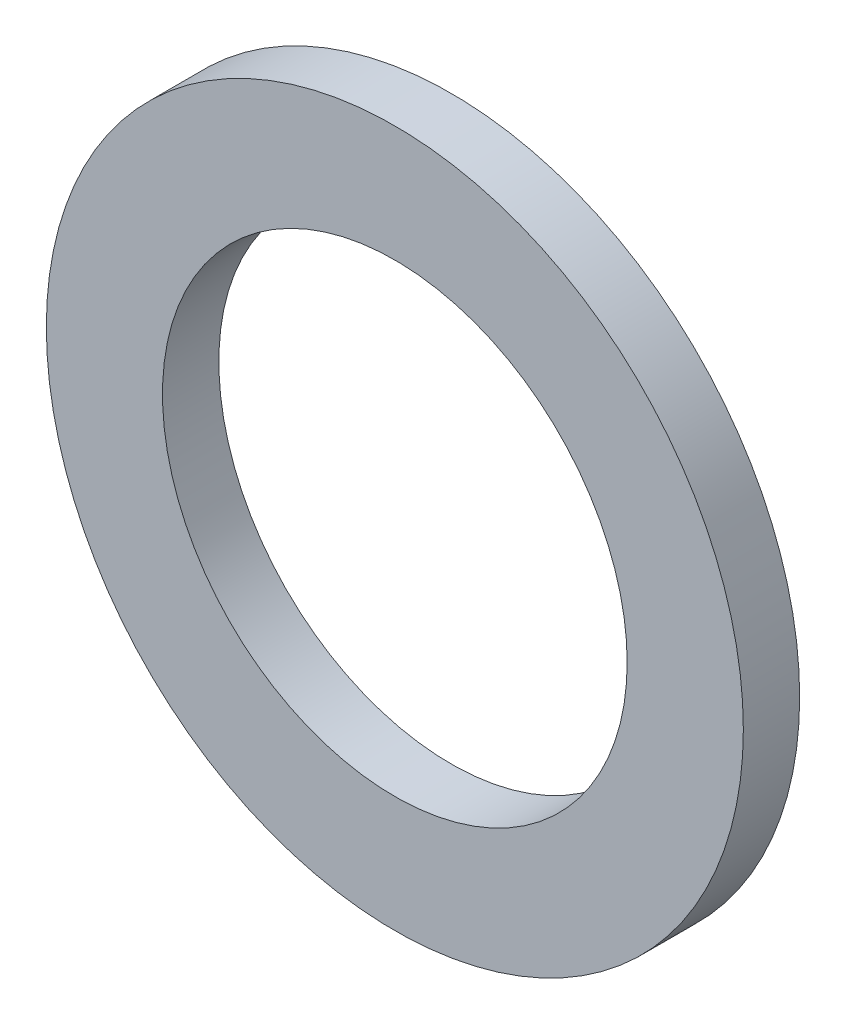
ISO-10303-21;
HEADER;
FILE_DESCRIPTION(('STEP AP214'),'2;1');
FILE_NAME('part.step','',(''),(''),'','','');
FILE_SCHEMA(('AUTOMOTIVE_DESIGN { 1 0 10303 214 1 1 1 1 }'));
ENDSEC;
DATA;
#1=APPLICATION_CONTEXT('core data for automotive mechanical design processes');
#2=APPLICATION_PROTOCOL_DEFINITION('international standard','automotive_design',2000,#1);
#3=PRODUCT_CONTEXT('',#1,'mechanical');
#4=PRODUCT('Part','Part','',(#3));
#5=PRODUCT_RELATED_PRODUCT_CATEGORY('part','',(#4));
#6=PRODUCT_DEFINITION_FORMATION('','',#4);
#7=PRODUCT_DEFINITION_CONTEXT('part definition',#1,'design');
#8=PRODUCT_DEFINITION('design','',#6,#7);
#9=PRODUCT_DEFINITION_SHAPE('','',#8);
#10=(LENGTH_UNIT() NAMED_UNIT(*) SI_UNIT(.MILLI.,.METRE.));
#11=(NAMED_UNIT(*) PLANE_ANGLE_UNIT() SI_UNIT($,.RADIAN.));
#12=(NAMED_UNIT(*) SI_UNIT($,.STERADIAN.) SOLID_ANGLE_UNIT());
#13=UNCERTAINTY_MEASURE_WITH_UNIT(LENGTH_MEASURE(1.E-05),#10,'distance_accuracy_value','');
#14=(GEOMETRIC_REPRESENTATION_CONTEXT(3) GLOBAL_UNCERTAINTY_ASSIGNED_CONTEXT((#13)) GLOBAL_UNIT_ASSIGNED_CONTEXT((#10,
#11,#12)) REPRESENTATION_CONTEXT('',''));
#15=CARTESIAN_POINT('',(0.,0.,0.));
#16=DIRECTION('',(0.,0.,1.));
#17=DIRECTION('',(1.,0.,0.));
#18=AXIS2_PLACEMENT_3D('',#15,#16,#17);
#19=CARTESIAN_POINT('',(0.,0.,0.));
#20=DIRECTION('',(0.,0.,-1.));
#21=DIRECTION('',(1.,0.,0.));
#22=AXIS2_PLACEMENT_3D('',#19,#20,#21);
#23=CYLINDRICAL_SURFACE('',#22,1.23749816);
#24=CARTESIAN_POINT('',(0.,0.,0.1999996));
#25=DIRECTION('',(0.,0.,1.));
#26=DIRECTION('',(1.,0.,0.));
#27=AXIS2_PLACEMENT_3D('',#24,#25,#26);
#28=CIRCLE('',#27,1.23749816);
#29=CARTESIAN_POINT('',(1.23749816,0.,0.1999996));
#30=VERTEX_POINT('',#29);
#31=EDGE_CURVE('E11',#30,#30,#28,.T.);
#32=ORIENTED_EDGE('',*,*,#31,.F.);
#33=DIRECTION('',(0.,0.,1.));
#34=VECTOR('',#33,1.);
#35=CARTESIAN_POINT('',(1.23749816,0.,0.));
#36=LINE('',#35,#34);
#37=CARTESIAN_POINT('',(1.23749816,0.,0.));
#38=VERTEX_POINT('',#37);
#39=EDGE_CURVE('E24',#38,#30,#36,.T.);
#40=ORIENTED_EDGE('',*,*,#39,.F.);
#41=CARTESIAN_POINT('',(0.,0.,0.));
#42=DIRECTION('',(0.,0.,1.));
#43=DIRECTION('',(1.,0.,0.));
#44=AXIS2_PLACEMENT_3D('',#41,#42,#43);
#45=CIRCLE('',#44,1.23749816);
#46=EDGE_CURVE('E46',#38,#38,#45,.T.);
#47=ORIENTED_EDGE('',*,*,#46,.T.);
#48=ORIENTED_EDGE('',*,*,#39,.T.);
#49=EDGE_LOOP('',(#32,#40,#47,#48));
#50=FACE_BOUND('',#49,.T.);
#51=ADVANCED_FACE('F17',(#50),#23,.T.);
#52=CARTESIAN_POINT('',(0.,0.,0.));
#53=DIRECTION('',(0.,0.,-1.));
#54=DIRECTION('',(1.,0.,0.));
#55=AXIS2_PLACEMENT_3D('',#52,#53,#54);
#56=CYLINDRICAL_SURFACE('',#55,0.82499962);
#57=DIRECTION('',(0.,0.,1.));
#58=VECTOR('',#57,1.);
#59=CARTESIAN_POINT('',(0.82499962,0.,0.));
#60=LINE('',#59,#58);
#61=CARTESIAN_POINT('',(0.82499962,0.,0.));
#62=VERTEX_POINT('',#61);
#63=CARTESIAN_POINT('',(0.82499962,0.,0.1999996));
#64=VERTEX_POINT('',#63);
#65=EDGE_CURVE('E40',#62,#64,#60,.T.);
#66=ORIENTED_EDGE('',*,*,#65,.T.);
#67=CARTESIAN_POINT('',(0.,0.,0.1999996));
#68=DIRECTION('',(0.,0.,1.));
#69=DIRECTION('',(1.,0.,0.));
#70=AXIS2_PLACEMENT_3D('',#67,#68,#69);
#71=CIRCLE('',#70,0.82499962);
#72=EDGE_CURVE('E45',#64,#64,#71,.T.);
#73=ORIENTED_EDGE('',*,*,#72,.T.);
#74=ORIENTED_EDGE('',*,*,#65,.F.);
#75=CARTESIAN_POINT('',(0.,0.,0.));
#76=DIRECTION('',(0.,0.,1.));
#77=DIRECTION('',(1.,0.,0.));
#78=AXIS2_PLACEMENT_3D('',#75,#76,#77);
#79=CIRCLE('',#78,0.82499962);
#80=EDGE_CURVE('E43',#62,#62,#79,.T.);
#81=ORIENTED_EDGE('',*,*,#80,.F.);
#82=EDGE_LOOP('',(#66,#73,#74,#81));
#83=FACE_BOUND('',#82,.T.);
#84=ADVANCED_FACE('F42',(#83),#56,.F.);
#85=CARTESIAN_POINT('',(1.23749816,0.,0.));
#86=DIRECTION('',(0.,0.,-1.));
#87=DIRECTION('',(-1.,0.,0.));
#88=AXIS2_PLACEMENT_3D('',#85,#86,#87);
#89=PLANE('',#88);
#90=ORIENTED_EDGE('',*,*,#46,.F.);
#91=EDGE_LOOP('',(#90));
#92=FACE_BOUND('',#91,.T.);
#93=ORIENTED_EDGE('',*,*,#80,.T.);
#94=EDGE_LOOP('',(#93));
#95=FACE_BOUND('',#94,.T.);
#96=ADVANCED_FACE('F49',(#92,#95),#89,.T.);
#97=CARTESIAN_POINT('',(1.23749816,0.,0.1999996));
#98=DIRECTION('',(0.,0.,-1.));
#99=DIRECTION('',(-1.,0.,0.));
#100=AXIS2_PLACEMENT_3D('',#97,#98,#99);
#101=PLANE('',#100);
#102=ORIENTED_EDGE('',*,*,#31,.T.);
#103=EDGE_LOOP('',(#102));
#104=FACE_BOUND('',#103,.T.);
#105=ORIENTED_EDGE('',*,*,#72,.F.);
#106=EDGE_LOOP('',(#105));
#107=FACE_BOUND('',#106,.T.);
#108=ADVANCED_FACE('F56',(#104,#107),#101,.F.);
#109=CLOSED_SHELL('',(#51,#84,#96,#108));
#110=MANIFOLD_SOLID_BREP('B1',#109);
#111=ADVANCED_BREP_SHAPE_REPRESENTATION('',(#18,#110),#14);
#112=SHAPE_DEFINITION_REPRESENTATION(#9,#111);
ENDSEC;
END-ISO-10303-21;
